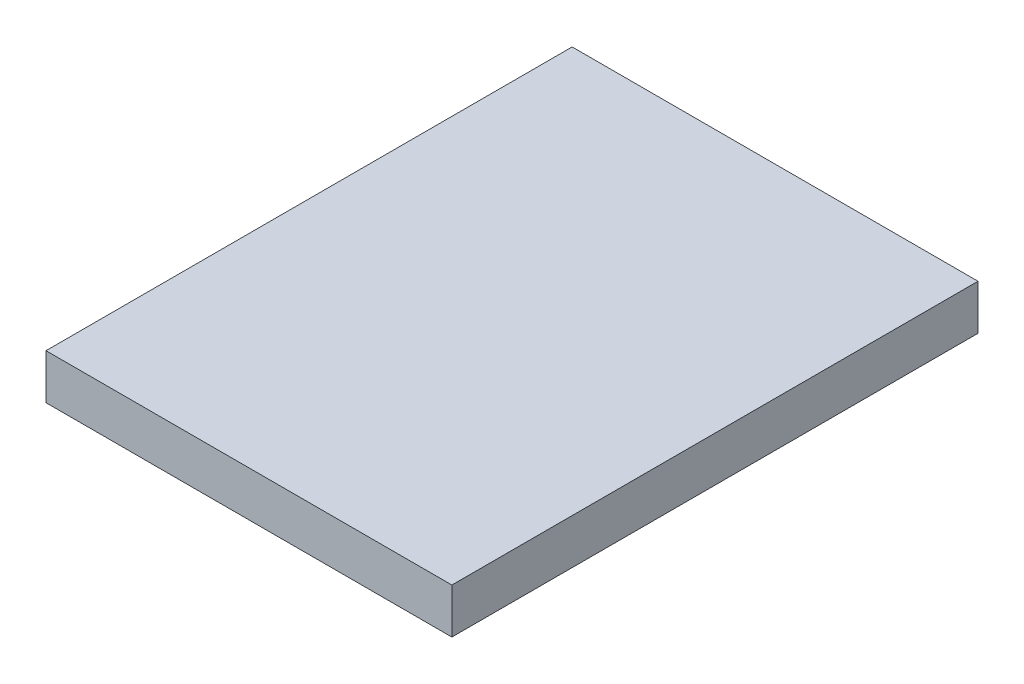
ISO-10303-21;
HEADER;
FILE_DESCRIPTION(('STEP AP214'),'2;1');
FILE_NAME('part.step','',(''),(''),'','','');
FILE_SCHEMA(('AUTOMOTIVE_DESIGN { 1 0 10303 214 1 1 1 1 }'));
ENDSEC;
DATA;
#1=APPLICATION_CONTEXT('core data for automotive mechanical design processes');
#2=APPLICATION_PROTOCOL_DEFINITION('international standard','automotive_design',2000,#1);
#3=PRODUCT_CONTEXT('',#1,'mechanical');
#4=PRODUCT('Part','Part','',(#3));
#5=PRODUCT_RELATED_PRODUCT_CATEGORY('part','',(#4));
#6=PRODUCT_DEFINITION_FORMATION('','',#4);
#7=PRODUCT_DEFINITION_CONTEXT('part definition',#1,'design');
#8=PRODUCT_DEFINITION('design','',#6,#7);
#9=PRODUCT_DEFINITION_SHAPE('','',#8);
#10=(LENGTH_UNIT() NAMED_UNIT(*) SI_UNIT(.MILLI.,.METRE.));
#11=(NAMED_UNIT(*) PLANE_ANGLE_UNIT() SI_UNIT($,.RADIAN.));
#12=(NAMED_UNIT(*) SI_UNIT($,.STERADIAN.) SOLID_ANGLE_UNIT());
#13=UNCERTAINTY_MEASURE_WITH_UNIT(LENGTH_MEASURE(1.E-05),#10,'distance_accuracy_value','');
#14=(GEOMETRIC_REPRESENTATION_CONTEXT(3) GLOBAL_UNCERTAINTY_ASSIGNED_CONTEXT((#13)) GLOBAL_UNIT_ASSIGNED_CONTEXT((#10,
#11,#12)) REPRESENTATION_CONTEXT('',''));
#15=CARTESIAN_POINT('',(0.,0.,0.));
#16=DIRECTION('',(0.,0.,1.));
#17=DIRECTION('',(1.,0.,0.));
#18=AXIS2_PLACEMENT_3D('',#15,#16,#17);
#19=CARTESIAN_POINT('',(0.,300.,0.));
#20=DIRECTION('',(1.,0.,0.));
#21=DIRECTION('',(0.,0.,-1.));
#22=AXIS2_PLACEMENT_3D('',#19,#20,#21);
#23=PLANE('',#22);
#24=DIRECTION('',(0.,0.,1.));
#25=VECTOR('',#24,1.);
#26=CARTESIAN_POINT('',(0.,0.,0.));
#27=LINE('',#26,#25);
#28=CARTESIAN_POINT('',(0.,0.,-3500.));
#29=VERTEX_POINT('',#28);
#30=CARTESIAN_POINT('',(0.,0.,0.));
#31=VERTEX_POINT('',#30);
#32=EDGE_CURVE('E113',#29,#31,#27,.T.);
#33=ORIENTED_EDGE('',*,*,#32,.T.);
#34=DIRECTION('',(0.,-1.,0.));
#35=VECTOR('',#34,1.);
#36=CARTESIAN_POINT('',(0.,300.,0.));
#37=LINE('',#36,#35);
#38=CARTESIAN_POINT('',(0.,300.,0.));
#39=VERTEX_POINT('',#38);
#40=EDGE_CURVE('E11',#39,#31,#37,.T.);
#41=ORIENTED_EDGE('',*,*,#40,.F.);
#42=DIRECTION('',(0.,0.,1.));
#43=VECTOR('',#42,1.);
#44=CARTESIAN_POINT('',(0.,300.,0.));
#45=LINE('',#44,#43);
#46=CARTESIAN_POINT('',(0.,300.,-3500.));
#47=VERTEX_POINT('',#46);
#48=EDGE_CURVE('E97',#47,#39,#45,.T.);
#49=ORIENTED_EDGE('',*,*,#48,.F.);
#50=DIRECTION('',(0.,-1.,0.));
#51=VECTOR('',#50,1.);
#52=CARTESIAN_POINT('',(0.,300.,-3500.));
#53=LINE('',#52,#51);
#54=EDGE_CURVE('E109',#47,#29,#53,.T.);
#55=ORIENTED_EDGE('',*,*,#54,.T.);
#56=EDGE_LOOP('',(#33,#41,#49,#55));
#57=FACE_BOUND('',#56,.T.);
#58=ADVANCED_FACE('F45',(#57),#23,.F.);
#59=CARTESIAN_POINT('',(0.,300.,0.));
#60=DIRECTION('',(0.,0.,-1.));
#61=DIRECTION('',(-1.,0.,0.));
#62=AXIS2_PLACEMENT_3D('',#59,#60,#61);
#63=PLANE('',#62);
#64=DIRECTION('',(1.,0.,0.));
#65=VECTOR('',#64,1.);
#66=CARTESIAN_POINT('',(0.,0.,0.));
#67=LINE('',#66,#65);
#68=CARTESIAN_POINT('',(2700.,0.,0.));
#69=VERTEX_POINT('',#68);
#70=EDGE_CURVE('E102',#31,#69,#67,.T.);
#71=ORIENTED_EDGE('',*,*,#70,.T.);
#72=DIRECTION('',(0.,-1.,0.));
#73=VECTOR('',#72,1.);
#74=CARTESIAN_POINT('',(2700.,300.,0.));
#75=LINE('',#74,#73);
#76=CARTESIAN_POINT('',(2700.,300.,0.));
#77=VERTEX_POINT('',#76);
#78=EDGE_CURVE('E54',#77,#69,#75,.T.);
#79=ORIENTED_EDGE('',*,*,#78,.F.);
#80=DIRECTION('',(1.,0.,0.));
#81=VECTOR('',#80,1.);
#82=CARTESIAN_POINT('',(0.,300.,0.));
#83=LINE('',#82,#81);
#84=EDGE_CURVE('E92',#39,#77,#83,.T.);
#85=ORIENTED_EDGE('',*,*,#84,.F.);
#86=ORIENTED_EDGE('',*,*,#40,.T.);
#87=EDGE_LOOP('',(#71,#79,#85,#86));
#88=FACE_BOUND('',#87,.T.);
#89=ADVANCED_FACE('F101',(#88),#63,.F.);
#90=CARTESIAN_POINT('',(2700.,300.,0.));
#91=DIRECTION('',(-1.,0.,0.));
#92=DIRECTION('',(0.,0.,1.));
#93=AXIS2_PLACEMENT_3D('',#90,#91,#92);
#94=PLANE('',#93);
#95=DIRECTION('',(0.,0.,-1.));
#96=VECTOR('',#95,1.);
#97=CARTESIAN_POINT('',(2700.,0.,0.));
#98=LINE('',#97,#96);
#99=CARTESIAN_POINT('',(2700.,0.,-3500.));
#100=VERTEX_POINT('',#99);
#101=EDGE_CURVE('E79',#69,#100,#98,.T.);
#102=ORIENTED_EDGE('',*,*,#101,.T.);
#103=DIRECTION('',(0.,-1.,0.));
#104=VECTOR('',#103,1.);
#105=CARTESIAN_POINT('',(2700.,300.,-3500.));
#106=LINE('',#105,#104);
#107=CARTESIAN_POINT('',(2700.,300.,-3500.));
#108=VERTEX_POINT('',#107);
#109=EDGE_CURVE('E104',#108,#100,#106,.T.);
#110=ORIENTED_EDGE('',*,*,#109,.F.);
#111=DIRECTION('',(0.,0.,-1.));
#112=VECTOR('',#111,1.);
#113=CARTESIAN_POINT('',(2700.,300.,0.));
#114=LINE('',#113,#112);
#115=EDGE_CURVE('E95',#77,#108,#114,.T.);
#116=ORIENTED_EDGE('',*,*,#115,.F.);
#117=ORIENTED_EDGE('',*,*,#78,.T.);
#118=EDGE_LOOP('',(#102,#110,#116,#117));
#119=FACE_BOUND('',#118,.T.);
#120=ADVANCED_FACE('F105',(#119),#94,.F.);
#121=CARTESIAN_POINT('',(0.,300.,-3500.));
#122=DIRECTION('',(0.,0.,1.));
#123=DIRECTION('',(1.,0.,0.));
#124=AXIS2_PLACEMENT_3D('',#121,#122,#123);
#125=PLANE('',#124);
#126=DIRECTION('',(-1.,0.,0.));
#127=VECTOR('',#126,1.);
#128=CARTESIAN_POINT('',(0.,0.,-3500.));
#129=LINE('',#128,#127);
#130=EDGE_CURVE('E85',#100,#29,#129,.T.);
#131=ORIENTED_EDGE('',*,*,#130,.T.);
#132=ORIENTED_EDGE('',*,*,#54,.F.);
#133=DIRECTION('',(-1.,0.,0.));
#134=VECTOR('',#133,1.);
#135=CARTESIAN_POINT('',(0.,300.,-3500.));
#136=LINE('',#135,#134);
#137=EDGE_CURVE('E62',#108,#47,#136,.T.);
#138=ORIENTED_EDGE('',*,*,#137,.F.);
#139=ORIENTED_EDGE('',*,*,#109,.T.);
#140=EDGE_LOOP('',(#131,#132,#138,#139));
#141=FACE_BOUND('',#140,.T.);
#142=ADVANCED_FACE('F126',(#141),#125,.F.);
#143=CARTESIAN_POINT('',(0.,300.,0.));
#144=DIRECTION('',(0.,-1.,0.));
#145=DIRECTION('',(0.,0.,-1.));
#146=AXIS2_PLACEMENT_3D('',#143,#144,#145);
#147=PLANE('',#146);
#148=ORIENTED_EDGE('',*,*,#48,.T.);
#149=ORIENTED_EDGE('',*,*,#84,.T.);
#150=ORIENTED_EDGE('',*,*,#115,.T.);
#151=ORIENTED_EDGE('',*,*,#137,.T.);
#152=EDGE_LOOP('',(#148,#149,#150,#151));
#153=FACE_BOUND('',#152,.T.);
#154=ADVANCED_FACE('F93',(#153),#147,.F.);
#155=CARTESIAN_POINT('',(0.,0.,0.));
#156=DIRECTION('',(0.,-1.,0.));
#157=DIRECTION('',(0.,0.,-1.));
#158=AXIS2_PLACEMENT_3D('',#155,#156,#157);
#159=PLANE('',#158);
#160=ORIENTED_EDGE('',*,*,#32,.F.);
#161=ORIENTED_EDGE('',*,*,#130,.F.);
#162=ORIENTED_EDGE('',*,*,#101,.F.);
#163=ORIENTED_EDGE('',*,*,#70,.F.);
#164=EDGE_LOOP('',(#160,#161,#162,#163));
#165=FACE_BOUND('',#164,.T.);
#166=ADVANCED_FACE('F129',(#165),#159,.T.);
#167=CLOSED_SHELL('',(#58,#89,#120,#142,#154,#166));
#168=MANIFOLD_SOLID_BREP('B2',#167);
#169=ADVANCED_BREP_SHAPE_REPRESENTATION('',(#18,#168),#14);
#170=SHAPE_DEFINITION_REPRESENTATION(#9,#169);
ENDSEC;
END-ISO-10303-21;
